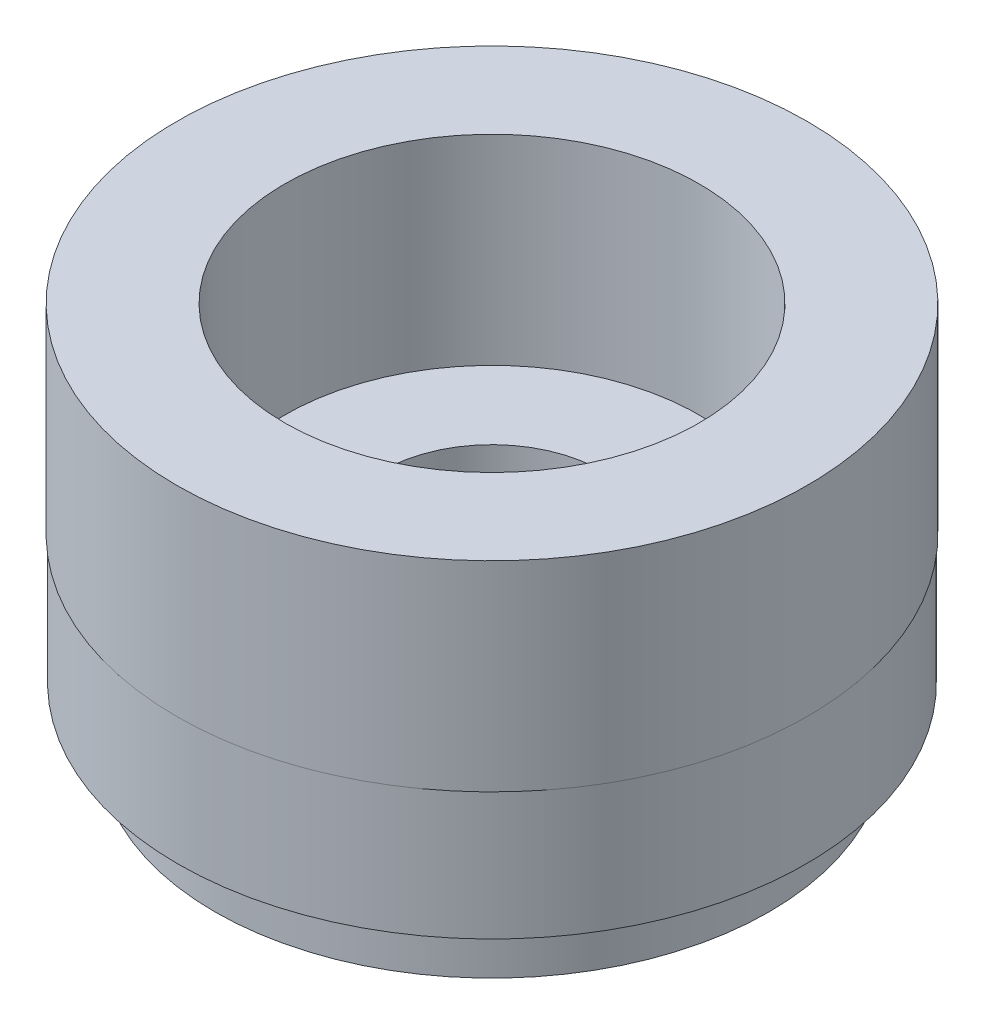
ISO-10303-21;
HEADER;
FILE_DESCRIPTION(('STEP AP214'),'2;1');
FILE_NAME('part.step','',(''),(''),'','','');
FILE_SCHEMA(('AUTOMOTIVE_DESIGN { 1 0 10303 214 1 1 1 1 }'));
ENDSEC;
DATA;
#1=APPLICATION_CONTEXT('core data for automotive mechanical design processes');
#2=APPLICATION_PROTOCOL_DEFINITION('international standard','automotive_design',2000,#1);
#3=PRODUCT_CONTEXT('',#1,'mechanical');
#4=PRODUCT('Part','Part','',(#3));
#5=PRODUCT_RELATED_PRODUCT_CATEGORY('part','',(#4));
#6=PRODUCT_DEFINITION_FORMATION('','',#4);
#7=PRODUCT_DEFINITION_CONTEXT('part definition',#1,'design');
#8=PRODUCT_DEFINITION('design','',#6,#7);
#9=PRODUCT_DEFINITION_SHAPE('','',#8);
#10=(LENGTH_UNIT() NAMED_UNIT(*) SI_UNIT(.MILLI.,.METRE.));
#11=(NAMED_UNIT(*) PLANE_ANGLE_UNIT() SI_UNIT($,.RADIAN.));
#12=(NAMED_UNIT(*) SI_UNIT($,.STERADIAN.) SOLID_ANGLE_UNIT());
#13=UNCERTAINTY_MEASURE_WITH_UNIT(LENGTH_MEASURE(1.E-05),#10,'distance_accuracy_value','');
#14=(GEOMETRIC_REPRESENTATION_CONTEXT(3) GLOBAL_UNCERTAINTY_ASSIGNED_CONTEXT((#13)) GLOBAL_UNIT_ASSIGNED_CONTEXT((#10,
#11,#12)) REPRESENTATION_CONTEXT('',''));
#15=CARTESIAN_POINT('',(0.,0.,0.));
#16=DIRECTION('',(0.,0.,1.));
#17=DIRECTION('',(1.,0.,0.));
#18=AXIS2_PLACEMENT_3D('',#15,#16,#17);
#19=CARTESIAN_POINT('',(0.,1.6256,0.));
#20=DIRECTION('',(0.,-1.,0.));
#21=DIRECTION('',(0.,0.,-1.));
#22=AXIS2_PLACEMENT_3D('',#19,#20,#21);
#23=CYLINDRICAL_SURFACE('',#22,3.9878);
#24=CARTESIAN_POINT('',(0.,1.6256,0.));
#25=DIRECTION('',(0.,1.,0.));
#26=DIRECTION('',(0.,0.,1.));
#27=AXIS2_PLACEMENT_3D('',#24,#25,#26);
#28=CIRCLE('',#27,3.9878);
#29=CARTESIAN_POINT('',(0.,1.6256,3.9878));
#30=VERTEX_POINT('',#29);
#31=EDGE_CURVE('E45',#30,#30,#28,.T.);
#32=ORIENTED_EDGE('',*,*,#31,.F.);
#33=EDGE_LOOP('',(#32));
#34=FACE_BOUND('',#33,.T.);
#35=CARTESIAN_POINT('',(0.,0.,0.));
#36=DIRECTION('',(0.,1.,0.));
#37=DIRECTION('',(0.,0.,1.));
#38=AXIS2_PLACEMENT_3D('',#35,#36,#37);
#39=CIRCLE('',#38,3.9878);
#40=CARTESIAN_POINT('',(0.,0.,3.9878));
#41=VERTEX_POINT('',#40);
#42=EDGE_CURVE('E51',#41,#41,#39,.T.);
#43=ORIENTED_EDGE('',*,*,#42,.T.);
#44=EDGE_LOOP('',(#43));
#45=FACE_BOUND('',#44,.T.);
#46=ADVANCED_FACE('F37',(#34,#45),#23,.T.);
#47=CARTESIAN_POINT('',(0.,0.,0.));
#48=DIRECTION('',(0.,1.,0.));
#49=DIRECTION('',(0.,0.,1.));
#50=AXIS2_PLACEMENT_3D('',#47,#48,#49);
#51=PLANE('',#50);
#52=CARTESIAN_POINT('',(0.,0.,0.));
#53=DIRECTION('',(0.,-1.,0.));
#54=DIRECTION('',(0.,0.,-1.));
#55=AXIS2_PLACEMENT_3D('',#52,#53,#54);
#56=CIRCLE('',#55,3.5179);
#57=CARTESIAN_POINT('',(0.,0.,3.5179));
#58=VERTEX_POINT('',#57);
#59=EDGE_CURVE('E10',#58,#58,#56,.T.);
#60=ORIENTED_EDGE('',*,*,#59,.F.);
#61=EDGE_LOOP('',(#60));
#62=FACE_BOUND('',#61,.T.);
#63=ORIENTED_EDGE('',*,*,#42,.F.);
#64=EDGE_LOOP('',(#63));
#65=FACE_BOUND('',#64,.T.);
#66=ADVANCED_FACE('F69',(#62,#65),#51,.F.);
#67=CARTESIAN_POINT('',(0.,4.1656,0.));
#68=DIRECTION('',(0.,-1.,0.));
#69=DIRECTION('',(0.,0.,-1.));
#70=AXIS2_PLACEMENT_3D('',#67,#68,#69);
#71=CYLINDRICAL_SURFACE('',#70,4.0005);
#72=CARTESIAN_POINT('',(0.,4.1656,0.));
#73=DIRECTION('',(0.,1.,0.));
#74=DIRECTION('',(0.,0.,1.));
#75=AXIS2_PLACEMENT_3D('',#72,#73,#74);
#76=CIRCLE('',#75,4.0005);
#77=CARTESIAN_POINT('',(0.,4.1656,4.0005));
#78=VERTEX_POINT('',#77);
#79=EDGE_CURVE('E57',#78,#78,#76,.T.);
#80=ORIENTED_EDGE('',*,*,#79,.F.);
#81=EDGE_LOOP('',(#80));
#82=FACE_BOUND('',#81,.T.);
#83=CARTESIAN_POINT('',(0.,1.6256,0.));
#84=DIRECTION('',(0.,1.,0.));
#85=DIRECTION('',(0.,0.,1.));
#86=AXIS2_PLACEMENT_3D('',#83,#84,#85);
#87=CIRCLE('',#86,4.0005);
#88=CARTESIAN_POINT('',(0.,1.6256,4.0005));
#89=VERTEX_POINT('',#88);
#90=EDGE_CURVE('E61',#89,#89,#87,.T.);
#91=ORIENTED_EDGE('',*,*,#90,.T.);
#92=EDGE_LOOP('',(#91));
#93=FACE_BOUND('',#92,.T.);
#94=ADVANCED_FACE('F71',(#82,#93),#71,.T.);
#95=CARTESIAN_POINT('',(0.,4.1656,0.));
#96=DIRECTION('',(0.,1.,0.));
#97=DIRECTION('',(0.,0.,1.));
#98=AXIS2_PLACEMENT_3D('',#95,#96,#97);
#99=PLANE('',#98);
#100=CARTESIAN_POINT('',(0.,4.1656,0.));
#101=DIRECTION('',(0.,1.,0.));
#102=DIRECTION('',(0.,0.,1.));
#103=AXIS2_PLACEMENT_3D('',#100,#101,#102);
#104=CIRCLE('',#103,2.6289);
#105=CARTESIAN_POINT('',(0.,4.1656,2.6289));
#106=VERTEX_POINT('',#105);
#107=EDGE_CURVE('E125',#106,#106,#104,.T.);
#108=ORIENTED_EDGE('',*,*,#107,.F.);
#109=EDGE_LOOP('',(#108));
#110=FACE_BOUND('',#109,.T.);
#111=ORIENTED_EDGE('',*,*,#79,.T.);
#112=EDGE_LOOP('',(#111));
#113=FACE_BOUND('',#112,.T.);
#114=ADVANCED_FACE('F77',(#110,#113),#99,.T.);
#115=CARTESIAN_POINT('',(0.,1.6256,0.));
#116=DIRECTION('',(0.,1.,0.));
#117=DIRECTION('',(0.,0.,1.));
#118=AXIS2_PLACEMENT_3D('',#115,#116,#117);
#119=PLANE('',#118);
#120=ORIENTED_EDGE('',*,*,#31,.T.);
#121=EDGE_LOOP('',(#120));
#122=FACE_BOUND('',#121,.T.);
#123=ORIENTED_EDGE('',*,*,#90,.F.);
#124=EDGE_LOOP('',(#123));
#125=FACE_BOUND('',#124,.T.);
#126=ADVANCED_FACE('F82',(#122,#125),#119,.F.);
#127=CARTESIAN_POINT('',(0.,-0.762,0.));
#128=DIRECTION('',(0.,1.,0.));
#129=DIRECTION('',(0.,0.,1.));
#130=AXIS2_PLACEMENT_3D('',#127,#128,#129);
#131=CYLINDRICAL_SURFACE('',#130,3.5179);
#132=CARTESIAN_POINT('',(0.,-0.762,0.));
#133=DIRECTION('',(0.,-1.,0.));
#134=DIRECTION('',(0.,0.,-1.));
#135=AXIS2_PLACEMENT_3D('',#132,#133,#134);
#136=CIRCLE('',#135,3.5179);
#137=CARTESIAN_POINT('',(0.,-0.762,3.5179));
#138=VERTEX_POINT('',#137);
#139=EDGE_CURVE('E55',#138,#138,#136,.T.);
#140=CARTESIAN_POINT('',(0.,-0.762,3.5179));
#141=CARTESIAN_POINT('',(0.,-0.7540625,3.5179));
#142=CARTESIAN_POINT('',(0.,-0.746125,3.5179));
#143=CARTESIAN_POINT('',(0.,-0.73025,3.5179));
#144=CARTESIAN_POINT('',(0.,-0.7223125,3.5179));
#145=CARTESIAN_POINT('',(0.,-0.7064375,3.5179));
#146=CARTESIAN_POINT('',(0.,-0.6985,3.5179));
#147=CARTESIAN_POINT('',(0.,-0.682625,3.5179));
#148=CARTESIAN_POINT('',(0.,-0.6746875,3.5179));
#149=CARTESIAN_POINT('',(0.,-0.6588125,3.5179));
#150=CARTESIAN_POINT('',(0.,-0.650875,3.5179));
#151=CARTESIAN_POINT('',(0.,-0.635,3.5179));
#152=CARTESIAN_POINT('',(0.,-0.6270625,3.5179));
#153=CARTESIAN_POINT('',(0.,-0.6111875,3.5179));
#154=CARTESIAN_POINT('',(0.,-0.60325,3.5179));
#155=CARTESIAN_POINT('',(0.,-0.587375,3.5179));
#156=CARTESIAN_POINT('',(0.,-0.5794375,3.5179));
#157=CARTESIAN_POINT('',(0.,-0.5635625,3.5179));
#158=CARTESIAN_POINT('',(0.,-0.555625,3.5179));
#159=CARTESIAN_POINT('',(0.,-0.53975,3.5179));
#160=CARTESIAN_POINT('',(0.,-0.5318125,3.5179));
#161=CARTESIAN_POINT('',(0.,-0.5159375,3.5179));
#162=CARTESIAN_POINT('',(0.,-0.508,3.5179));
#163=CARTESIAN_POINT('',(0.,-0.492125,3.5179));
#164=CARTESIAN_POINT('',(0.,-0.4841875,3.5179));
#165=CARTESIAN_POINT('',(0.,-0.4683125,3.5179));
#166=CARTESIAN_POINT('',(0.,-0.460375,3.5179));
#167=CARTESIAN_POINT('',(0.,-0.4445,3.5179));
#168=CARTESIAN_POINT('',(0.,-0.4365625,3.5179));
#169=CARTESIAN_POINT('',(0.,-0.4206875,3.5179));
#170=CARTESIAN_POINT('',(0.,-0.41275,3.5179));
#171=CARTESIAN_POINT('',(0.,-0.396875,3.5179));
#172=CARTESIAN_POINT('',(0.,-0.3889375,3.5179));
#173=CARTESIAN_POINT('',(0.,-0.3730625,3.5179));
#174=CARTESIAN_POINT('',(0.,-0.365125,3.5179));
#175=CARTESIAN_POINT('',(0.,-0.34925,3.5179));
#176=CARTESIAN_POINT('',(0.,-0.3413125,3.5179));
#177=CARTESIAN_POINT('',(0.,-0.3254375,3.5179));
#178=CARTESIAN_POINT('',(0.,-0.3175,3.5179));
#179=CARTESIAN_POINT('',(0.,-0.301625,3.5179));
#180=CARTESIAN_POINT('',(0.,-0.2936875,3.5179));
#181=CARTESIAN_POINT('',(0.,-0.2778125,3.5179));
#182=CARTESIAN_POINT('',(0.,-0.269875,3.5179));
#183=CARTESIAN_POINT('',(0.,-0.254,3.5179));
#184=CARTESIAN_POINT('',(0.,-0.2460625,3.5179));
#185=CARTESIAN_POINT('',(0.,-0.2301875,3.5179));
#186=CARTESIAN_POINT('',(0.,-0.22225,3.5179));
#187=CARTESIAN_POINT('',(0.,-0.206375,3.5179));
#188=CARTESIAN_POINT('',(0.,-0.1984375,3.5179));
#189=CARTESIAN_POINT('',(0.,-0.1825625,3.5179));
#190=CARTESIAN_POINT('',(0.,-0.174625,3.5179));
#191=CARTESIAN_POINT('',(0.,-0.15875,3.5179));
#192=CARTESIAN_POINT('',(0.,-0.1508125,3.5179));
#193=CARTESIAN_POINT('',(0.,-0.1349375,3.5179));
#194=CARTESIAN_POINT('',(0.,-0.127,3.5179));
#195=CARTESIAN_POINT('',(0.,-0.111125,3.5179));
#196=CARTESIAN_POINT('',(0.,-0.1031875,3.5179));
#197=CARTESIAN_POINT('',(0.,-0.0873125,3.5179));
#198=CARTESIAN_POINT('',(0.,-0.079375,3.5179));
#199=CARTESIAN_POINT('',(0.,-0.0635,3.5179));
#200=CARTESIAN_POINT('',(0.,-0.0555625,3.5179));
#201=CARTESIAN_POINT('',(0.,-0.0396875,3.5179));
#202=CARTESIAN_POINT('',(0.,-0.03175,3.5179));
#203=CARTESIAN_POINT('',(0.,-0.015875,3.5179));
#204=CARTESIAN_POINT('',(0.,-0.00793749999999999,3.5179));
#205=CARTESIAN_POINT('',(0.,0.,3.5179));
#206=B_SPLINE_CURVE_WITH_KNOTS('',3,(#140,#141,#142,#143,#144,#145,#146,#147,#148,#149,#150,
#151,#152,#153,#154,#155,#156,#157,#158,#159,#160,#161,#162,#163,#164,#165,#166,#167,#168,#169,
#170,#171,#172,#173,#174,#175,#176,#177,#178,#179,#180,#181,#182,#183,#184,#185,#186,#187,#188,
#189,#190,#191,#192,#193,#194,#195,#196,#197,#198,#199,#200,#201,#202,#203,#204,#205),
.UNSPECIFIED.,.F.,.F.,(4,2,2,2,2,2,2,2,2,2,2,2,2,2,2,2,2,2,2,2,2,2,2,2,2,2,2,2,2,2,2,2,4),(0.,
0.0238125,0.0476249999999999,0.0714374999999999,0.09525,0.1190625,0.142875,0.1666875,0.1905,
0.2143125,0.238125,0.2619375,0.28575,0.3095625,0.333375,0.3571875,0.381,0.4048125,0.428625,
0.4524375,0.47625,0.5000625,0.523875,0.5476875,0.5715,0.5953125,0.619125,0.6429375,0.66675,
0.6905625,0.714375,0.7381875,0.762),.UNSPECIFIED.);
#207=EDGE_CURVE('BSEAM85',#138,#58,#206,.T.);
#208=ORIENTED_EDGE('',*,*,#139,.F.);
#209=ORIENTED_EDGE('',*,*,#59,.T.);
#210=ORIENTED_EDGE('',*,*,#207,.T.);
#211=ORIENTED_EDGE('',*,*,#207,.F.);
#212=EDGE_LOOP('',(#208,#210,#209,#211));
#213=FACE_BOUND('',#212,.T.);
#214=ADVANCED_FACE('F85',(#213),#131,.T.);
#215=CARTESIAN_POINT('',(0.,-0.762,0.));
#216=DIRECTION('',(0.,-1.,0.));
#217=DIRECTION('',(0.,0.,-1.));
#218=AXIS2_PLACEMENT_3D('',#215,#216,#217);
#219=PLANE('',#218);
#220=CARTESIAN_POINT('',(0.,-0.762,0.));
#221=DIRECTION('',(0.,-1.,0.));
#222=DIRECTION('',(0.,0.,-1.));
#223=AXIS2_PLACEMENT_3D('',#220,#221,#222);
#224=CIRCLE('',#223,3.0099);
#225=CARTESIAN_POINT('',(0.,-0.762,-3.0099));
#226=VERTEX_POINT('',#225);
#227=EDGE_CURVE('E135',#226,#226,#224,.T.);
#228=ORIENTED_EDGE('',*,*,#227,.F.);
#229=EDGE_LOOP('',(#228));
#230=FACE_BOUND('',#229,.T.);
#231=ORIENTED_EDGE('',*,*,#139,.T.);
#232=EDGE_LOOP('',(#231));
#233=FACE_BOUND('',#232,.T.);
#234=ADVANCED_FACE('F92',(#230,#233),#219,.T.);
#235=CARTESIAN_POINT('',(0.,0.,0.));
#236=DIRECTION('',(0.,1.,0.));
#237=DIRECTION('',(0.,0.,1.));
#238=AXIS2_PLACEMENT_3D('',#235,#236,#237);
#239=PLANE('',#238);
#240=CARTESIAN_POINT('',(0.,0.,0.));
#241=DIRECTION('',(0.,1.,0.));
#242=DIRECTION('',(0.,0.,1.));
#243=AXIS2_PLACEMENT_3D('',#240,#241,#242);
#244=CIRCLE('',#243,1.397);
#245=CARTESIAN_POINT('',(0.,0.,1.397));
#246=VERTEX_POINT('',#245);
#247=EDGE_CURVE('E40',#246,#246,#244,.T.);
#248=ORIENTED_EDGE('',*,*,#247,.T.);
#249=EDGE_LOOP('',(#248));
#250=FACE_BOUND('',#249,.T.);
#251=CARTESIAN_POINT('',(0.,0.,0.));
#252=DIRECTION('',(0.,1.,0.));
#253=DIRECTION('',(0.,0.,1.));
#254=AXIS2_PLACEMENT_3D('',#251,#252,#253);
#255=CIRCLE('',#254,3.0099);
#256=CARTESIAN_POINT('',(0.,0.,3.0099));
#257=VERTEX_POINT('',#256);
#258=EDGE_CURVE('E139',#257,#257,#255,.F.);
#259=ORIENTED_EDGE('',*,*,#258,.T.);
#260=EDGE_LOOP('',(#259));
#261=FACE_BOUND('',#260,.T.);
#262=ADVANCED_FACE('F96',(#250,#261),#239,.F.);
#263=CARTESIAN_POINT('',(0.,8.51328280277356,0.));
#264=DIRECTION('',(0.,-1.,0.));
#265=DIRECTION('',(0.,0.,-1.));
#266=AXIS2_PLACEMENT_3D('',#263,#264,#265);
#267=CYLINDRICAL_SURFACE('',#266,3.0099);
#268=ORIENTED_EDGE('',*,*,#227,.T.);
#269=EDGE_LOOP('',(#268));
#270=FACE_BOUND('',#269,.T.);
#271=ORIENTED_EDGE('',*,*,#258,.F.);
#272=EDGE_LOOP('',(#271));
#273=FACE_BOUND('',#272,.T.);
#274=ADVANCED_FACE('F100',(#270,#273),#267,.F.);
#275=CARTESIAN_POINT('',(0.,1.6256,0.));
#276=DIRECTION('',(0.,1.,0.));
#277=DIRECTION('',(0.,0.,1.));
#278=AXIS2_PLACEMENT_3D('',#275,#276,#277);
#279=CYLINDRICAL_SURFACE('',#278,2.6289);
#280=CARTESIAN_POINT('',(0.,1.6256,0.));
#281=DIRECTION('',(0.,1.,0.));
#282=DIRECTION('',(0.,0.,1.));
#283=AXIS2_PLACEMENT_3D('',#280,#281,#282);
#284=CIRCLE('',#283,2.6289);
#285=CARTESIAN_POINT('',(0.,1.6256,2.6289));
#286=VERTEX_POINT('',#285);
#287=EDGE_CURVE('E129',#286,#286,#284,.T.);
#288=ORIENTED_EDGE('',*,*,#287,.F.);
#289=EDGE_LOOP('',(#288));
#290=FACE_BOUND('',#289,.T.);
#291=ORIENTED_EDGE('',*,*,#107,.T.);
#292=EDGE_LOOP('',(#291));
#293=FACE_BOUND('',#292,.T.);
#294=ADVANCED_FACE('F104',(#290,#293),#279,.F.);
#295=CARTESIAN_POINT('',(0.,1.6256,0.));
#296=DIRECTION('',(0.,1.,0.));
#297=DIRECTION('',(0.,0.,1.));
#298=AXIS2_PLACEMENT_3D('',#295,#296,#297);
#299=PLANE('',#298);
#300=CARTESIAN_POINT('',(0.,1.6256,0.));
#301=DIRECTION('',(0.,1.,0.));
#302=DIRECTION('',(0.,0.,1.));
#303=AXIS2_PLACEMENT_3D('',#300,#301,#302);
#304=CIRCLE('',#303,1.397);
#305=CARTESIAN_POINT('',(0.,1.6256,1.397));
#306=VERTEX_POINT('',#305);
#307=EDGE_CURVE('E121',#306,#306,#304,.T.);
#308=ORIENTED_EDGE('',*,*,#307,.F.);
#309=EDGE_LOOP('',(#308));
#310=FACE_BOUND('',#309,.T.);
#311=ORIENTED_EDGE('',*,*,#287,.T.);
#312=EDGE_LOOP('',(#311));
#313=FACE_BOUND('',#312,.T.);
#314=ADVANCED_FACE('F108',(#310,#313),#299,.T.);
#315=CARTESIAN_POINT('',(0.,-0.762,0.));
#316=DIRECTION('',(0.,1.,0.));
#317=DIRECTION('',(0.,0.,1.));
#318=AXIS2_PLACEMENT_3D('',#315,#316,#317);
#319=CYLINDRICAL_SURFACE('',#318,1.397);
#320=ORIENTED_EDGE('',*,*,#307,.T.);
#321=EDGE_LOOP('',(#320));
#322=FACE_BOUND('',#321,.T.);
#323=ORIENTED_EDGE('',*,*,#247,.F.);
#324=EDGE_LOOP('',(#323));
#325=FACE_BOUND('',#324,.T.);
#326=ADVANCED_FACE('F112',(#322,#325),#319,.F.);
#327=CLOSED_SHELL('',(#46,#66,#94,#114,#126,#214,#234,#262,#274,#294,#314,#326));
#328=MANIFOLD_SOLID_BREP('B2',#327);
#329=ADVANCED_BREP_SHAPE_REPRESENTATION('',(#18,#328),#14);
#330=SHAPE_DEFINITION_REPRESENTATION(#9,#329);
ENDSEC;
END-ISO-10303-21;
